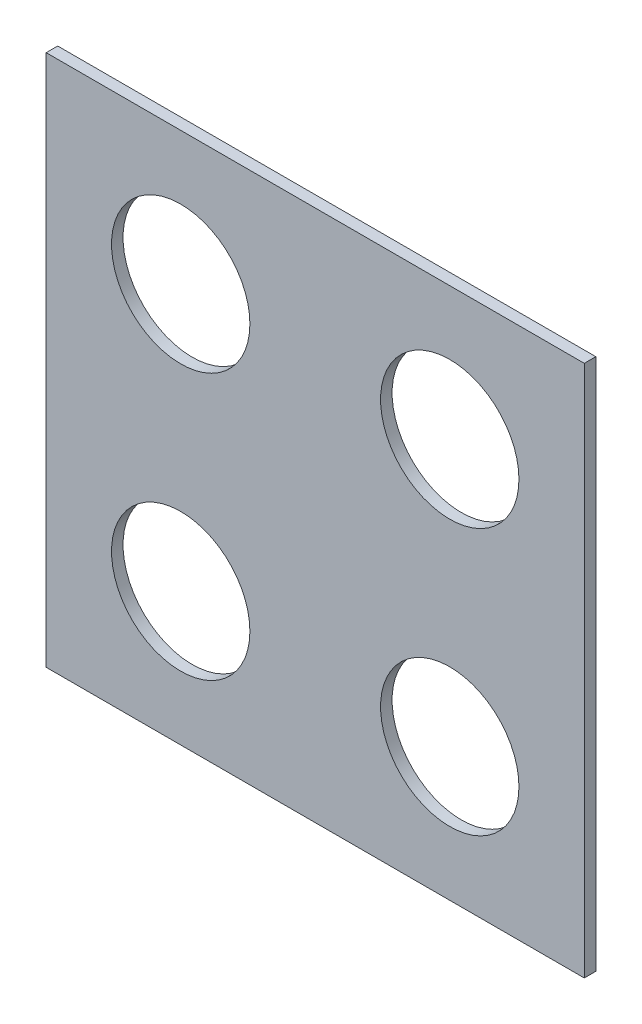
ISO-10303-21;
HEADER;
FILE_DESCRIPTION(('STEP AP214'),'2;1');
FILE_NAME('part.step','',(''),(''),'','','');
FILE_SCHEMA(('AUTOMOTIVE_DESIGN { 1 0 10303 214 1 1 1 1 }'));
ENDSEC;
DATA;
#1=APPLICATION_CONTEXT('core data for automotive mechanical design processes');
#2=APPLICATION_PROTOCOL_DEFINITION('international standard','automotive_design',2000,#1);
#3=PRODUCT_CONTEXT('',#1,'mechanical');
#4=PRODUCT('Part','Part','',(#3));
#5=PRODUCT_RELATED_PRODUCT_CATEGORY('part','',(#4));
#6=PRODUCT_DEFINITION_FORMATION('','',#4);
#7=PRODUCT_DEFINITION_CONTEXT('part definition',#1,'design');
#8=PRODUCT_DEFINITION('design','',#6,#7);
#9=PRODUCT_DEFINITION_SHAPE('','',#8);
#10=(LENGTH_UNIT() NAMED_UNIT(*) SI_UNIT(.MILLI.,.METRE.));
#11=(NAMED_UNIT(*) PLANE_ANGLE_UNIT() SI_UNIT($,.RADIAN.));
#12=(NAMED_UNIT(*) SI_UNIT($,.STERADIAN.) SOLID_ANGLE_UNIT());
#13=UNCERTAINTY_MEASURE_WITH_UNIT(LENGTH_MEASURE(1.E-05),#10,'distance_accuracy_value','');
#14=(GEOMETRIC_REPRESENTATION_CONTEXT(3) GLOBAL_UNCERTAINTY_ASSIGNED_CONTEXT((#13)) GLOBAL_UNIT_ASSIGNED_CONTEXT((#10,
#11,#12)) REPRESENTATION_CONTEXT('',''));
#15=CARTESIAN_POINT('',(0.,0.,0.));
#16=DIRECTION('',(0.,0.,1.));
#17=DIRECTION('',(1.,0.,0.));
#18=AXIS2_PLACEMENT_3D('',#15,#16,#17);
#19=CARTESIAN_POINT('',(-140.,-138.5,6.));
#20=DIRECTION('',(1.,0.,0.));
#21=DIRECTION('',(0.,0.,-1.));
#22=AXIS2_PLACEMENT_3D('',#19,#20,#21);
#23=PLANE('',#22);
#24=DIRECTION('',(0.,-1.,0.));
#25=VECTOR('',#24,1.);
#26=CARTESIAN_POINT('',(-140.,-138.5,0.));
#27=LINE('',#26,#25);
#28=CARTESIAN_POINT('',(-140.,138.5,0.));
#29=VERTEX_POINT('',#28);
#30=CARTESIAN_POINT('',(-140.,-138.5,0.));
#31=VERTEX_POINT('',#30);
#32=EDGE_CURVE('E96',#29,#31,#27,.T.);
#33=ORIENTED_EDGE('',*,*,#32,.T.);
#34=DIRECTION('',(0.,0.,-1.));
#35=VECTOR('',#34,1.);
#36=CARTESIAN_POINT('',(-140.,-138.5,6.));
#37=LINE('',#36,#35);
#38=CARTESIAN_POINT('',(-140.,-138.5,6.));
#39=VERTEX_POINT('',#38);
#40=EDGE_CURVE('E11',#39,#31,#37,.T.);
#41=ORIENTED_EDGE('',*,*,#40,.F.);
#42=DIRECTION('',(0.,-1.,0.));
#43=VECTOR('',#42,1.);
#44=CARTESIAN_POINT('',(-140.,-138.5,6.));
#45=LINE('',#44,#43);
#46=CARTESIAN_POINT('',(-140.,138.5,6.));
#47=VERTEX_POINT('',#46);
#48=EDGE_CURVE('E84',#47,#39,#45,.T.);
#49=ORIENTED_EDGE('',*,*,#48,.F.);
#50=DIRECTION('',(0.,0.,-1.));
#51=VECTOR('',#50,1.);
#52=CARTESIAN_POINT('',(-140.,138.5,6.));
#53=LINE('',#52,#51);
#54=EDGE_CURVE('E92',#47,#29,#53,.T.);
#55=ORIENTED_EDGE('',*,*,#54,.T.);
#56=EDGE_LOOP('',(#33,#41,#49,#55));
#57=FACE_BOUND('',#56,.T.);
#58=ADVANCED_FACE('F33',(#57),#23,.F.);
#59=CARTESIAN_POINT('',(140.,-138.5,6.));
#60=DIRECTION('',(0.,1.,0.));
#61=DIRECTION('',(-1.,0.,0.));
#62=AXIS2_PLACEMENT_3D('',#59,#60,#61);
#63=PLANE('',#62);
#64=DIRECTION('',(1.,0.,0.));
#65=VECTOR('',#64,1.);
#66=CARTESIAN_POINT('',(140.,-138.5,0.));
#67=LINE('',#66,#65);
#68=CARTESIAN_POINT('',(140.,-138.5,0.));
#69=VERTEX_POINT('',#68);
#70=EDGE_CURVE('E88',#31,#69,#67,.T.);
#71=ORIENTED_EDGE('',*,*,#70,.T.);
#72=DIRECTION('',(0.,0.,-1.));
#73=VECTOR('',#72,1.);
#74=CARTESIAN_POINT('',(140.,-138.5,6.));
#75=LINE('',#74,#73);
#76=CARTESIAN_POINT('',(140.,-138.5,6.));
#77=VERTEX_POINT('',#76);
#78=EDGE_CURVE('E41',#77,#69,#75,.T.);
#79=ORIENTED_EDGE('',*,*,#78,.F.);
#80=DIRECTION('',(1.,0.,0.));
#81=VECTOR('',#80,1.);
#82=CARTESIAN_POINT('',(140.,-138.5,6.));
#83=LINE('',#82,#81);
#84=EDGE_CURVE('E79',#39,#77,#83,.T.);
#85=ORIENTED_EDGE('',*,*,#84,.F.);
#86=ORIENTED_EDGE('',*,*,#40,.T.);
#87=EDGE_LOOP('',(#71,#79,#85,#86));
#88=FACE_BOUND('',#87,.T.);
#89=ADVANCED_FACE('F87',(#88),#63,.F.);
#90=CARTESIAN_POINT('',(140.,-138.5,6.));
#91=DIRECTION('',(-1.,0.,0.));
#92=DIRECTION('',(0.,0.,1.));
#93=AXIS2_PLACEMENT_3D('',#90,#91,#92);
#94=PLANE('',#93);
#95=DIRECTION('',(0.,1.,0.));
#96=VECTOR('',#95,1.);
#97=CARTESIAN_POINT('',(140.,-138.5,0.));
#98=LINE('',#97,#96);
#99=CARTESIAN_POINT('',(140.,138.5,0.));
#100=VERTEX_POINT('',#99);
#101=EDGE_CURVE('E66',#69,#100,#98,.T.);
#102=ORIENTED_EDGE('',*,*,#101,.T.);
#103=DIRECTION('',(0.,0.,-1.));
#104=VECTOR('',#103,1.);
#105=CARTESIAN_POINT('',(140.,138.5,6.));
#106=LINE('',#105,#104);
#107=CARTESIAN_POINT('',(140.,138.5,6.));
#108=VERTEX_POINT('',#107);
#109=EDGE_CURVE('E89',#108,#100,#106,.T.);
#110=ORIENTED_EDGE('',*,*,#109,.F.);
#111=DIRECTION('',(0.,1.,0.));
#112=VECTOR('',#111,1.);
#113=CARTESIAN_POINT('',(140.,-138.5,6.));
#114=LINE('',#113,#112);
#115=EDGE_CURVE('E82',#77,#108,#114,.T.);
#116=ORIENTED_EDGE('',*,*,#115,.F.);
#117=ORIENTED_EDGE('',*,*,#78,.T.);
#118=EDGE_LOOP('',(#102,#110,#116,#117));
#119=FACE_BOUND('',#118,.T.);
#120=ADVANCED_FACE('F90',(#119),#94,.F.);
#121=CARTESIAN_POINT('',(140.,138.5,6.));
#122=DIRECTION('',(0.,-1.,0.));
#123=DIRECTION('',(1.,0.,0.));
#124=AXIS2_PLACEMENT_3D('',#121,#122,#123);
#125=PLANE('',#124);
#126=DIRECTION('',(-1.,0.,0.));
#127=VECTOR('',#126,1.);
#128=CARTESIAN_POINT('',(140.,138.5,0.));
#129=LINE('',#128,#127);
#130=EDGE_CURVE('E72',#100,#29,#129,.T.);
#131=ORIENTED_EDGE('',*,*,#130,.T.);
#132=ORIENTED_EDGE('',*,*,#54,.F.);
#133=DIRECTION('',(-1.,0.,0.));
#134=VECTOR('',#133,1.);
#135=CARTESIAN_POINT('',(140.,138.5,6.));
#136=LINE('',#135,#134);
#137=EDGE_CURVE('E49',#108,#47,#136,.T.);
#138=ORIENTED_EDGE('',*,*,#137,.F.);
#139=ORIENTED_EDGE('',*,*,#109,.T.);
#140=EDGE_LOOP('',(#131,#132,#138,#139));
#141=FACE_BOUND('',#140,.T.);
#142=ADVANCED_FACE('F104',(#141),#125,.F.);
#143=CARTESIAN_POINT('',(0.,0.,6.));
#144=DIRECTION('',(0.,0.,1.));
#145=DIRECTION('',(1.,0.,0.));
#146=AXIS2_PLACEMENT_3D('',#143,#144,#145);
#147=PLANE('',#146);
#148=CARTESIAN_POINT('',(-70.,-69.25,6.));
#149=DIRECTION('',(0.,0.,1.));
#150=DIRECTION('',(1.,0.,0.));
#151=AXIS2_PLACEMENT_3D('',#148,#149,#150);
#152=CIRCLE('',#151,36.);
#153=CARTESIAN_POINT('',(-34.,-69.25,6.));
#154=VERTEX_POINT('',#153);
#155=EDGE_CURVE('E128',#154,#154,#152,.T.);
#156=ORIENTED_EDGE('',*,*,#155,.F.);
#157=EDGE_LOOP('',(#156));
#158=FACE_BOUND('',#157,.T.);
#159=CARTESIAN_POINT('',(70.,-69.25,6.));
#160=DIRECTION('',(0.,0.,1.));
#161=DIRECTION('',(1.,0.,0.));
#162=AXIS2_PLACEMENT_3D('',#159,#160,#161);
#163=CIRCLE('',#162,36.);
#164=CARTESIAN_POINT('',(106.,-69.25,6.));
#165=VERTEX_POINT('',#164);
#166=EDGE_CURVE('E122',#165,#165,#163,.T.);
#167=ORIENTED_EDGE('',*,*,#166,.F.);
#168=EDGE_LOOP('',(#167));
#169=FACE_BOUND('',#168,.T.);
#170=CARTESIAN_POINT('',(70.,69.25,6.));
#171=DIRECTION('',(0.,0.,1.));
#172=DIRECTION('',(1.,0.,0.));
#173=AXIS2_PLACEMENT_3D('',#170,#171,#172);
#174=CIRCLE('',#173,36.);
#175=CARTESIAN_POINT('',(106.,69.25,6.));
#176=VERTEX_POINT('',#175);
#177=EDGE_CURVE('E116',#176,#176,#174,.T.);
#178=ORIENTED_EDGE('',*,*,#177,.F.);
#179=EDGE_LOOP('',(#178));
#180=FACE_BOUND('',#179,.T.);
#181=CARTESIAN_POINT('',(-70.,69.25,6.));
#182=DIRECTION('',(0.,0.,1.));
#183=DIRECTION('',(1.,0.,0.));
#184=AXIS2_PLACEMENT_3D('',#181,#182,#183);
#185=CIRCLE('',#184,36.);
#186=CARTESIAN_POINT('',(-34.,69.25,6.));
#187=VERTEX_POINT('',#186);
#188=EDGE_CURVE('E110',#187,#187,#185,.T.);
#189=ORIENTED_EDGE('',*,*,#188,.F.);
#190=EDGE_LOOP('',(#189));
#191=FACE_BOUND('',#190,.T.);
#192=ORIENTED_EDGE('',*,*,#48,.T.);
#193=ORIENTED_EDGE('',*,*,#84,.T.);
#194=ORIENTED_EDGE('',*,*,#115,.T.);
#195=ORIENTED_EDGE('',*,*,#137,.T.);
#196=EDGE_LOOP('',(#192,#193,#194,#195));
#197=FACE_BOUND('',#196,.T.);
#198=ADVANCED_FACE('F80',(#158,#169,#180,#191,#197),#147,.T.);
#199=CARTESIAN_POINT('',(0.,0.,0.));
#200=DIRECTION('',(0.,0.,1.));
#201=DIRECTION('',(1.,0.,0.));
#202=AXIS2_PLACEMENT_3D('',#199,#200,#201);
#203=PLANE('',#202);
#204=CARTESIAN_POINT('',(-70.,-69.25,0.));
#205=DIRECTION('',(0.,0.,1.));
#206=DIRECTION('',(1.,0.,0.));
#207=AXIS2_PLACEMENT_3D('',#204,#205,#206);
#208=CIRCLE('',#207,36.);
#209=CARTESIAN_POINT('',(-34.,-69.25,0.));
#210=VERTEX_POINT('',#209);
#211=EDGE_CURVE('E113',#210,#210,#208,.T.);
#212=ORIENTED_EDGE('',*,*,#211,.T.);
#213=EDGE_LOOP('',(#212));
#214=FACE_BOUND('',#213,.T.);
#215=CARTESIAN_POINT('',(70.,-69.25,0.));
#216=DIRECTION('',(0.,0.,1.));
#217=DIRECTION('',(1.,0.,0.));
#218=AXIS2_PLACEMENT_3D('',#215,#216,#217);
#219=CIRCLE('',#218,36.);
#220=CARTESIAN_POINT('',(106.,-69.25,0.));
#221=VERTEX_POINT('',#220);
#222=EDGE_CURVE('E125',#221,#221,#219,.T.);
#223=ORIENTED_EDGE('',*,*,#222,.T.);
#224=EDGE_LOOP('',(#223));
#225=FACE_BOUND('',#224,.T.);
#226=CARTESIAN_POINT('',(70.,69.25,0.));
#227=DIRECTION('',(0.,0.,1.));
#228=DIRECTION('',(1.,0.,0.));
#229=AXIS2_PLACEMENT_3D('',#226,#227,#228);
#230=CIRCLE('',#229,36.);
#231=CARTESIAN_POINT('',(106.,69.25,0.));
#232=VERTEX_POINT('',#231);
#233=EDGE_CURVE('E119',#232,#232,#230,.T.);
#234=ORIENTED_EDGE('',*,*,#233,.T.);
#235=EDGE_LOOP('',(#234));
#236=FACE_BOUND('',#235,.T.);
#237=CARTESIAN_POINT('',(-70.,69.25,0.));
#238=DIRECTION('',(0.,0.,1.));
#239=DIRECTION('',(1.,0.,0.));
#240=AXIS2_PLACEMENT_3D('',#237,#238,#239);
#241=CIRCLE('',#240,36.);
#242=CARTESIAN_POINT('',(-34.,69.25,0.));
#243=VERTEX_POINT('',#242);
#244=EDGE_CURVE('E99',#243,#243,#241,.T.);
#245=ORIENTED_EDGE('',*,*,#244,.T.);
#246=EDGE_LOOP('',(#245));
#247=FACE_BOUND('',#246,.T.);
#248=ORIENTED_EDGE('',*,*,#32,.F.);
#249=ORIENTED_EDGE('',*,*,#130,.F.);
#250=ORIENTED_EDGE('',*,*,#101,.F.);
#251=ORIENTED_EDGE('',*,*,#70,.F.);
#252=EDGE_LOOP('',(#248,#249,#250,#251));
#253=FACE_BOUND('',#252,.T.);
#254=ADVANCED_FACE('F107',(#214,#225,#236,#247,#253),#203,.F.);
#255=CARTESIAN_POINT('',(-70.,69.25,0.));
#256=DIRECTION('',(0.,0.,1.));
#257=DIRECTION('',(1.,0.,0.));
#258=AXIS2_PLACEMENT_3D('',#255,#256,#257);
#259=CYLINDRICAL_SURFACE('',#258,36.);
#260=ORIENTED_EDGE('',*,*,#244,.F.);
#261=EDGE_LOOP('',(#260));
#262=FACE_BOUND('',#261,.T.);
#263=ORIENTED_EDGE('',*,*,#188,.T.);
#264=EDGE_LOOP('',(#263));
#265=FACE_BOUND('',#264,.T.);
#266=ADVANCED_FACE('F152',(#262,#265),#259,.F.);
#267=CARTESIAN_POINT('',(70.,69.25,0.));
#268=DIRECTION('',(0.,0.,1.));
#269=DIRECTION('',(1.,0.,0.));
#270=AXIS2_PLACEMENT_3D('',#267,#268,#269);
#271=CYLINDRICAL_SURFACE('',#270,36.);
#272=ORIENTED_EDGE('',*,*,#233,.F.);
#273=EDGE_LOOP('',(#272));
#274=FACE_BOUND('',#273,.T.);
#275=ORIENTED_EDGE('',*,*,#177,.T.);
#276=EDGE_LOOP('',(#275));
#277=FACE_BOUND('',#276,.T.);
#278=ADVANCED_FACE('F154',(#274,#277),#271,.F.);
#279=CARTESIAN_POINT('',(70.,-69.25,0.));
#280=DIRECTION('',(0.,0.,1.));
#281=DIRECTION('',(1.,0.,0.));
#282=AXIS2_PLACEMENT_3D('',#279,#280,#281);
#283=CYLINDRICAL_SURFACE('',#282,36.);
#284=ORIENTED_EDGE('',*,*,#222,.F.);
#285=EDGE_LOOP('',(#284));
#286=FACE_BOUND('',#285,.T.);
#287=ORIENTED_EDGE('',*,*,#166,.T.);
#288=EDGE_LOOP('',(#287));
#289=FACE_BOUND('',#288,.T.);
#290=ADVANCED_FACE('F139',(#286,#289),#283,.F.);
#291=CARTESIAN_POINT('',(-70.,-69.25,0.));
#292=DIRECTION('',(0.,0.,1.));
#293=DIRECTION('',(1.,0.,0.));
#294=AXIS2_PLACEMENT_3D('',#291,#292,#293);
#295=CYLINDRICAL_SURFACE('',#294,36.);
#296=ORIENTED_EDGE('',*,*,#211,.F.);
#297=EDGE_LOOP('',(#296));
#298=FACE_BOUND('',#297,.T.);
#299=ORIENTED_EDGE('',*,*,#155,.T.);
#300=EDGE_LOOP('',(#299));
#301=FACE_BOUND('',#300,.T.);
#302=ADVANCED_FACE('F136',(#298,#301),#295,.F.);
#303=CLOSED_SHELL('',(#58,#89,#120,#142,#198,#254,#266,#278,#290,#302));
#304=MANIFOLD_SOLID_BREP('B2',#303);
#305=ADVANCED_BREP_SHAPE_REPRESENTATION('',(#18,#304),#14);
#306=SHAPE_DEFINITION_REPRESENTATION(#9,#305);
ENDSEC;
END-ISO-10303-21;
